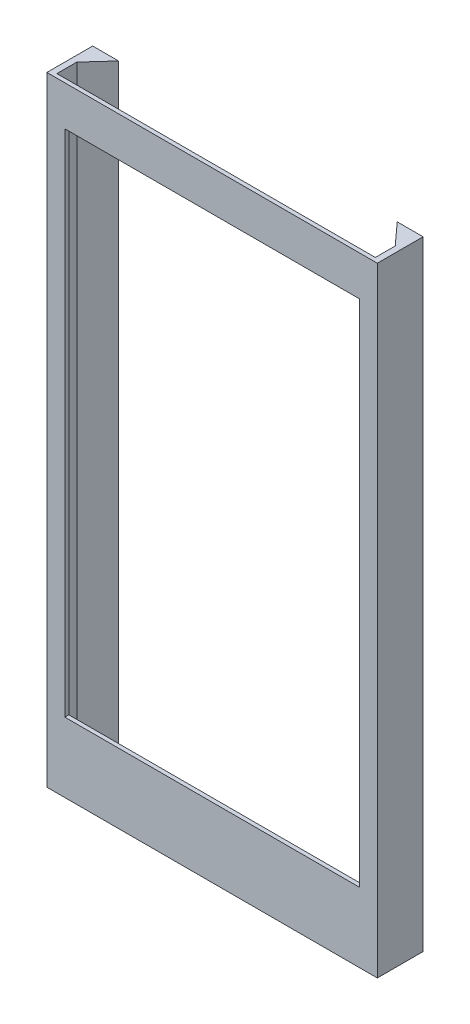
ISO-10303-21;
HEADER;
FILE_DESCRIPTION(('STEP AP214'),'2;1');
FILE_NAME('part.step','',(''),(''),'','','');
FILE_SCHEMA(('AUTOMOTIVE_DESIGN { 1 0 10303 214 1 1 1 1 }'));
ENDSEC;
DATA;
#1=APPLICATION_CONTEXT('core data for automotive mechanical design processes');
#2=APPLICATION_PROTOCOL_DEFINITION('international standard','automotive_design',2000,#1);
#3=PRODUCT_CONTEXT('',#1,'mechanical');
#4=PRODUCT('Part','Part','',(#3));
#5=PRODUCT_RELATED_PRODUCT_CATEGORY('part','',(#4));
#6=PRODUCT_DEFINITION_FORMATION('','',#4);
#7=PRODUCT_DEFINITION_CONTEXT('part definition',#1,'design');
#8=PRODUCT_DEFINITION('design','',#6,#7);
#9=PRODUCT_DEFINITION_SHAPE('','',#8);
#10=(LENGTH_UNIT() NAMED_UNIT(*) SI_UNIT(.MILLI.,.METRE.));
#11=(NAMED_UNIT(*) PLANE_ANGLE_UNIT() SI_UNIT($,.RADIAN.));
#12=(NAMED_UNIT(*) SI_UNIT($,.STERADIAN.) SOLID_ANGLE_UNIT());
#13=UNCERTAINTY_MEASURE_WITH_UNIT(LENGTH_MEASURE(1.E-05),#10,'distance_accuracy_value','');
#14=(GEOMETRIC_REPRESENTATION_CONTEXT(3) GLOBAL_UNCERTAINTY_ASSIGNED_CONTEXT((#13)) GLOBAL_UNIT_ASSIGNED_CONTEXT((#10,
#11,#12)) REPRESENTATION_CONTEXT('',''));
#15=CARTESIAN_POINT('',(0.,0.,0.));
#16=DIRECTION('',(0.,0.,1.));
#17=DIRECTION('',(1.,0.,0.));
#18=AXIS2_PLACEMENT_3D('',#15,#16,#17);
#19=CARTESIAN_POINT('',(40.,-77.,10.5));
#20=DIRECTION('',(0.,-1.,0.));
#21=DIRECTION('',(0.,0.,-1.));
#22=AXIS2_PLACEMENT_3D('',#19,#20,#21);
#23=PLANE('',#22);
#24=DIRECTION('',(0.672672793996312,0.,0.739940073395944));
#25=VECTOR('',#24,1.);
#26=CARTESIAN_POINT('',(40.,-77.,5.5));
#27=LINE('',#26,#25);
#28=CARTESIAN_POINT('',(35.,-77.,0.));
#29=VERTEX_POINT('',#28);
#30=CARTESIAN_POINT('',(40.,-77.,5.5));
#31=VERTEX_POINT('',#30);
#32=EDGE_CURVE('E55',#29,#31,#27,.T.);
#33=ORIENTED_EDGE('',*,*,#32,.F.);
#34=DIRECTION('',(-1.,0.,0.));
#35=VECTOR('',#34,1.);
#36=CARTESIAN_POINT('',(40.,-77.,0.));
#37=LINE('',#36,#35);
#38=CARTESIAN_POINT('',(-35.,-77.,0.));
#39=VERTEX_POINT('',#38);
#40=EDGE_CURVE('E165',#29,#39,#37,.T.);
#41=ORIENTED_EDGE('',*,*,#40,.T.);
#42=DIRECTION('',(0.672672793996312,0.,-0.739940073395944));
#43=VECTOR('',#42,1.);
#44=CARTESIAN_POINT('',(-40.,-77.,5.5));
#45=LINE('',#44,#43);
#46=CARTESIAN_POINT('',(-40.,-77.,5.5));
#47=VERTEX_POINT('',#46);
#48=EDGE_CURVE('E167',#47,#39,#45,.T.);
#49=ORIENTED_EDGE('',*,*,#48,.F.);
#50=DIRECTION('',(0.,0.,-1.));
#51=VECTOR('',#50,1.);
#52=CARTESIAN_POINT('',(-40.,-77.,10.5));
#53=LINE('',#52,#51);
#54=CARTESIAN_POINT('',(-40.,-77.,10.5));
#55=VERTEX_POINT('',#54);
#56=EDGE_CURVE('E212',#55,#47,#53,.T.);
#57=ORIENTED_EDGE('',*,*,#56,.F.);
#58=DIRECTION('',(-1.,0.,0.));
#59=VECTOR('',#58,1.);
#60=CARTESIAN_POINT('',(40.,-77.,10.5));
#61=LINE('',#60,#59);
#62=CARTESIAN_POINT('',(40.,-77.,10.5));
#63=VERTEX_POINT('',#62);
#64=EDGE_CURVE('E191',#63,#55,#61,.T.);
#65=ORIENTED_EDGE('',*,*,#64,.F.);
#66=DIRECTION('',(0.,0.,-1.));
#67=VECTOR('',#66,1.);
#68=CARTESIAN_POINT('',(40.,-77.,10.5));
#69=LINE('',#68,#67);
#70=EDGE_CURVE('E202',#63,#31,#69,.T.);
#71=ORIENTED_EDGE('',*,*,#70,.T.);
#72=EDGE_LOOP('',(#33,#41,#49,#57,#65,#71));
#73=FACE_BOUND('',#72,.T.);
#74=ADVANCED_FACE('F39',(#73),#23,.F.);
#75=CARTESIAN_POINT('',(40.,77.,10.5));
#76=DIRECTION('',(1.,0.,0.));
#77=DIRECTION('',(0.,0.,-1.));
#78=AXIS2_PLACEMENT_3D('',#75,#76,#77);
#79=PLANE('',#78);
#80=DIRECTION('',(0.,-1.,0.));
#81=VECTOR('',#80,1.);
#82=CARTESIAN_POINT('',(40.,77.,5.5));
#83=LINE('',#82,#81);
#84=CARTESIAN_POINT('',(40.,77.,5.5));
#85=VERTEX_POINT('',#84);
#86=EDGE_CURVE('E160',#85,#31,#83,.T.);
#87=ORIENTED_EDGE('',*,*,#86,.T.);
#88=ORIENTED_EDGE('',*,*,#70,.F.);
#89=DIRECTION('',(0.,-1.,0.));
#90=VECTOR('',#89,1.);
#91=CARTESIAN_POINT('',(40.,77.,10.5));
#92=LINE('',#91,#90);
#93=CARTESIAN_POINT('',(40.,77.,10.5));
#94=VERTEX_POINT('',#93);
#95=EDGE_CURVE('E187',#94,#63,#92,.T.);
#96=ORIENTED_EDGE('',*,*,#95,.F.);
#97=DIRECTION('',(0.,0.,-1.));
#98=VECTOR('',#97,1.);
#99=CARTESIAN_POINT('',(40.,77.,10.5));
#100=LINE('',#99,#98);
#101=EDGE_CURVE('E63',#94,#85,#100,.T.);
#102=ORIENTED_EDGE('',*,*,#101,.T.);
#103=EDGE_LOOP('',(#87,#88,#96,#102));
#104=FACE_BOUND('',#103,.T.);
#105=ADVANCED_FACE('F334',(#104),#79,.F.);
#106=CARTESIAN_POINT('',(-40.,77.,10.5));
#107=DIRECTION('',(-1.,0.,0.));
#108=DIRECTION('',(0.,0.,1.));
#109=AXIS2_PLACEMENT_3D('',#106,#107,#108);
#110=PLANE('',#109);
#111=DIRECTION('',(0.,-1.,0.));
#112=VECTOR('',#111,1.);
#113=CARTESIAN_POINT('',(-40.,77.,5.5));
#114=LINE('',#113,#112);
#115=CARTESIAN_POINT('',(-40.,77.,5.5));
#116=VERTEX_POINT('',#115);
#117=EDGE_CURVE('E183',#116,#47,#114,.T.);
#118=ORIENTED_EDGE('',*,*,#117,.F.);
#119=DIRECTION('',(0.,0.,-1.));
#120=VECTOR('',#119,1.);
#121=CARTESIAN_POINT('',(-40.,77.,10.5));
#122=LINE('',#121,#120);
#123=CARTESIAN_POINT('',(-40.,77.,10.5));
#124=VERTEX_POINT('',#123);
#125=EDGE_CURVE('E208',#124,#116,#122,.T.);
#126=ORIENTED_EDGE('',*,*,#125,.F.);
#127=DIRECTION('',(0.,1.,0.));
#128=VECTOR('',#127,1.);
#129=CARTESIAN_POINT('',(-40.,77.,10.5));
#130=LINE('',#129,#128);
#131=EDGE_CURVE('E195',#55,#124,#130,.T.);
#132=ORIENTED_EDGE('',*,*,#131,.F.);
#133=ORIENTED_EDGE('',*,*,#56,.T.);
#134=EDGE_LOOP('',(#118,#126,#132,#133));
#135=FACE_BOUND('',#134,.T.);
#136=ADVANCED_FACE('F327',(#135),#110,.F.);
#137=CARTESIAN_POINT('',(-37.,67.,11.5));
#138=DIRECTION('',(1.,0.,0.));
#139=DIRECTION('',(0.,1.,0.));
#140=AXIS2_PLACEMENT_3D('',#137,#138,#139);
#141=PLANE('',#140);
#142=DIRECTION('',(0.,0.,-1.));
#143=VECTOR('',#142,1.);
#144=CARTESIAN_POINT('',(-37.,-61.,11.5));
#145=LINE('',#144,#143);
#146=CARTESIAN_POINT('',(-37.,-61.,11.5));
#147=VERTEX_POINT('',#146);
#148=CARTESIAN_POINT('',(-37.,-61.,10.5));
#149=VERTEX_POINT('',#148);
#150=EDGE_CURVE('E254',#147,#149,#145,.T.);
#151=ORIENTED_EDGE('',*,*,#150,.T.);
#152=DIRECTION('',(0.,1.,0.));
#153=VECTOR('',#152,1.);
#154=CARTESIAN_POINT('',(-37.,67.,10.5));
#155=LINE('',#154,#153);
#156=CARTESIAN_POINT('',(-37.,67.,10.5));
#157=VERTEX_POINT('',#156);
#158=EDGE_CURVE('E225',#149,#157,#155,.T.);
#159=ORIENTED_EDGE('',*,*,#158,.T.);
#160=DIRECTION('',(0.,0.,-1.));
#161=VECTOR('',#160,1.);
#162=CARTESIAN_POINT('',(-37.,67.,11.5));
#163=LINE('',#162,#161);
#164=CARTESIAN_POINT('',(-37.,67.,11.5));
#165=VERTEX_POINT('',#164);
#166=EDGE_CURVE('E242',#165,#157,#163,.T.);
#167=ORIENTED_EDGE('',*,*,#166,.F.);
#168=DIRECTION('',(0.,-1.,0.));
#169=VECTOR('',#168,1.);
#170=CARTESIAN_POINT('',(-37.,67.,11.5));
#171=LINE('',#170,#169);
#172=EDGE_CURVE('E229',#165,#147,#171,.T.);
#173=ORIENTED_EDGE('',*,*,#172,.T.);
#174=EDGE_LOOP('',(#151,#159,#167,#173));
#175=FACE_BOUND('',#174,.T.);
#176=ADVANCED_FACE('F325',(#175),#141,.T.);
#177=CARTESIAN_POINT('',(-37.,-61.,11.5));
#178=DIRECTION('',(0.,1.,0.));
#179=DIRECTION('',(0.,0.,1.));
#180=AXIS2_PLACEMENT_3D('',#177,#178,#179);
#181=PLANE('',#180);
#182=DIRECTION('',(0.,0.,-1.));
#183=VECTOR('',#182,1.);
#184=CARTESIAN_POINT('',(37.,-61.,11.5));
#185=LINE('',#184,#183);
#186=CARTESIAN_POINT('',(37.,-61.,11.5));
#187=VERTEX_POINT('',#186);
#188=CARTESIAN_POINT('',(37.,-61.,10.5));
#189=VERTEX_POINT('',#188);
#190=EDGE_CURVE('E250',#187,#189,#185,.T.);
#191=ORIENTED_EDGE('',*,*,#190,.T.);
#192=DIRECTION('',(-1.,0.,0.));
#193=VECTOR('',#192,1.);
#194=CARTESIAN_POINT('',(-37.,-61.,10.5));
#195=LINE('',#194,#193);
#196=EDGE_CURVE('E221',#189,#149,#195,.T.);
#197=ORIENTED_EDGE('',*,*,#196,.T.);
#198=ORIENTED_EDGE('',*,*,#150,.F.);
#199=DIRECTION('',(1.,0.,0.));
#200=VECTOR('',#199,1.);
#201=CARTESIAN_POINT('',(-37.,-61.,11.5));
#202=LINE('',#201,#200);
#203=EDGE_CURVE('E232',#147,#187,#202,.T.);
#204=ORIENTED_EDGE('',*,*,#203,.T.);
#205=EDGE_LOOP('',(#191,#197,#198,#204));
#206=FACE_BOUND('',#205,.T.);
#207=ADVANCED_FACE('F316',(#206),#181,.T.);
#208=CARTESIAN_POINT('',(37.,67.,11.5));
#209=DIRECTION('',(-1.,0.,0.));
#210=DIRECTION('',(0.,-1.,0.));
#211=AXIS2_PLACEMENT_3D('',#208,#209,#210);
#212=PLANE('',#211);
#213=DIRECTION('',(0.,0.,-1.));
#214=VECTOR('',#213,1.);
#215=CARTESIAN_POINT('',(37.,67.,11.5));
#216=LINE('',#215,#214);
#217=CARTESIAN_POINT('',(37.,67.,11.5));
#218=VERTEX_POINT('',#217);
#219=CARTESIAN_POINT('',(37.,67.,10.5));
#220=VERTEX_POINT('',#219);
#221=EDGE_CURVE('E246',#218,#220,#216,.T.);
#222=ORIENTED_EDGE('',*,*,#221,.T.);
#223=DIRECTION('',(0.,-1.,0.));
#224=VECTOR('',#223,1.);
#225=CARTESIAN_POINT('',(37.,67.,10.5));
#226=LINE('',#225,#224);
#227=EDGE_CURVE('E207',#220,#189,#226,.T.);
#228=ORIENTED_EDGE('',*,*,#227,.T.);
#229=ORIENTED_EDGE('',*,*,#190,.F.);
#230=DIRECTION('',(0.,1.,0.));
#231=VECTOR('',#230,1.);
#232=CARTESIAN_POINT('',(37.,67.,11.5));
#233=LINE('',#232,#231);
#234=EDGE_CURVE('E235',#187,#218,#233,.T.);
#235=ORIENTED_EDGE('',*,*,#234,.T.);
#236=EDGE_LOOP('',(#222,#228,#229,#235));
#237=FACE_BOUND('',#236,.T.);
#238=ADVANCED_FACE('F318',(#237),#212,.T.);
#239=CARTESIAN_POINT('',(-37.,67.,11.5));
#240=DIRECTION('',(0.,-1.,0.));
#241=DIRECTION('',(0.,0.,-1.));
#242=AXIS2_PLACEMENT_3D('',#239,#240,#241);
#243=PLANE('',#242);
#244=ORIENTED_EDGE('',*,*,#166,.T.);
#245=DIRECTION('',(1.,0.,0.));
#246=VECTOR('',#245,1.);
#247=CARTESIAN_POINT('',(-37.,67.,10.5));
#248=LINE('',#247,#246);
#249=EDGE_CURVE('E11',#157,#220,#248,.T.);
#250=ORIENTED_EDGE('',*,*,#249,.T.);
#251=ORIENTED_EDGE('',*,*,#221,.F.);
#252=DIRECTION('',(-1.,0.,0.));
#253=VECTOR('',#252,1.);
#254=CARTESIAN_POINT('',(-37.,67.,11.5));
#255=LINE('',#254,#253);
#256=EDGE_CURVE('E239',#218,#165,#255,.T.);
#257=ORIENTED_EDGE('',*,*,#256,.T.);
#258=EDGE_LOOP('',(#244,#250,#251,#257));
#259=FACE_BOUND('',#258,.T.);
#260=ADVANCED_FACE('F307',(#259),#243,.T.);
#261=CARTESIAN_POINT('',(0.,0.,11.5));
#262=DIRECTION('',(0.,0.,1.));
#263=DIRECTION('',(1.,0.,0.));
#264=AXIS2_PLACEMENT_3D('',#261,#262,#263);
#265=PLANE('',#264);
#266=DIRECTION('',(-1.,0.,0.));
#267=VECTOR('',#266,1.);
#268=CARTESIAN_POINT('',(41.5,77.,11.5));
#269=LINE('',#268,#267);
#270=CARTESIAN_POINT('',(41.5,77.,11.5));
#271=VERTEX_POINT('',#270);
#272=CARTESIAN_POINT('',(-41.5,77.,11.5));
#273=VERTEX_POINT('',#272);
#274=EDGE_CURVE('E258',#271,#273,#269,.T.);
#275=ORIENTED_EDGE('',*,*,#274,.T.);
#276=DIRECTION('',(0.,-1.,0.));
#277=VECTOR('',#276,1.);
#278=CARTESIAN_POINT('',(-41.5,77.,11.5));
#279=LINE('',#278,#277);
#280=CARTESIAN_POINT('',(-41.5,-78.5,11.5));
#281=VERTEX_POINT('',#280);
#282=EDGE_CURVE('E261',#273,#281,#279,.T.);
#283=ORIENTED_EDGE('',*,*,#282,.T.);
#284=DIRECTION('',(1.,0.,0.));
#285=VECTOR('',#284,1.);
#286=CARTESIAN_POINT('',(-41.5,-78.5,11.5));
#287=LINE('',#286,#285);
#288=CARTESIAN_POINT('',(41.5,-78.5,11.5));
#289=VERTEX_POINT('',#288);
#290=EDGE_CURVE('E265',#281,#289,#287,.T.);
#291=ORIENTED_EDGE('',*,*,#290,.T.);
#292=DIRECTION('',(0.,1.,0.));
#293=VECTOR('',#292,1.);
#294=CARTESIAN_POINT('',(41.5,-78.5,11.5));
#295=LINE('',#294,#293);
#296=EDGE_CURVE('E268',#289,#271,#295,.T.);
#297=ORIENTED_EDGE('',*,*,#296,.T.);
#298=EDGE_LOOP('',(#275,#283,#291,#297));
#299=FACE_BOUND('',#298,.T.);
#300=ORIENTED_EDGE('',*,*,#203,.F.);
#301=ORIENTED_EDGE('',*,*,#172,.F.);
#302=ORIENTED_EDGE('',*,*,#256,.F.);
#303=ORIENTED_EDGE('',*,*,#234,.F.);
#304=EDGE_LOOP('',(#300,#301,#302,#303));
#305=FACE_BOUND('',#304,.T.);
#306=ADVANCED_FACE('F304',(#299,#305),#265,.T.);
#307=CARTESIAN_POINT('',(0.,0.,0.));
#308=DIRECTION('',(0.,0.,1.));
#309=DIRECTION('',(1.,0.,0.));
#310=AXIS2_PLACEMENT_3D('',#307,#308,#309);
#311=PLANE('',#310);
#312=ORIENTED_EDGE('',*,*,#40,.F.);
#313=DIRECTION('',(0.,-1.,0.));
#314=VECTOR('',#313,1.);
#315=CARTESIAN_POINT('',(35.,77.,0.));
#316=LINE('',#315,#314);
#317=CARTESIAN_POINT('',(35.,77.,0.));
#318=VERTEX_POINT('',#317);
#319=EDGE_CURVE('E159',#318,#29,#316,.T.);
#320=ORIENTED_EDGE('',*,*,#319,.F.);
#321=DIRECTION('',(-1.,0.,0.));
#322=VECTOR('',#321,1.);
#323=CARTESIAN_POINT('',(-40.,77.,0.));
#324=LINE('',#323,#322);
#325=CARTESIAN_POINT('',(41.5,77.,0.));
#326=VERTEX_POINT('',#325);
#327=EDGE_CURVE('E141',#326,#318,#324,.T.);
#328=ORIENTED_EDGE('',*,*,#327,.F.);
#329=DIRECTION('',(0.,1.,0.));
#330=VECTOR('',#329,1.);
#331=CARTESIAN_POINT('',(41.5,-78.5,0.));
#332=LINE('',#331,#330);
#333=CARTESIAN_POINT('',(41.5,-78.5,0.));
#334=VERTEX_POINT('',#333);
#335=EDGE_CURVE('E262',#334,#326,#332,.T.);
#336=ORIENTED_EDGE('',*,*,#335,.F.);
#337=DIRECTION('',(1.,0.,0.));
#338=VECTOR('',#337,1.);
#339=CARTESIAN_POINT('',(-41.5,-78.5,0.));
#340=LINE('',#339,#338);
#341=CARTESIAN_POINT('',(-41.5,-78.5,0.));
#342=VERTEX_POINT('',#341);
#343=EDGE_CURVE('E273',#342,#334,#340,.T.);
#344=ORIENTED_EDGE('',*,*,#343,.F.);
#345=DIRECTION('',(0.,-1.,0.));
#346=VECTOR('',#345,1.);
#347=CARTESIAN_POINT('',(-41.5,77.,0.));
#348=LINE('',#347,#346);
#349=CARTESIAN_POINT('',(-41.5,77.,0.));
#350=VERTEX_POINT('',#349);
#351=EDGE_CURVE('E153',#350,#342,#348,.T.);
#352=ORIENTED_EDGE('',*,*,#351,.F.);
#353=CARTESIAN_POINT('',(-35.,77.,0.));
#354=VERTEX_POINT('',#353);
#355=EDGE_CURVE('E154',#354,#350,#324,.T.);
#356=ORIENTED_EDGE('',*,*,#355,.F.);
#357=DIRECTION('',(0.,-1.,0.));
#358=VECTOR('',#357,1.);
#359=CARTESIAN_POINT('',(-35.,77.,0.));
#360=LINE('',#359,#358);
#361=EDGE_CURVE('E179',#354,#39,#360,.T.);
#362=ORIENTED_EDGE('',*,*,#361,.T.);
#363=EDGE_LOOP('',(#312,#320,#328,#336,#344,#352,#356,#362));
#364=FACE_BOUND('',#363,.T.);
#365=ADVANCED_FACE('F163',(#364),#311,.F.);
#366=CARTESIAN_POINT('',(-40.,77.,11.5));
#367=DIRECTION('',(0.,-1.,0.));
#368=DIRECTION('',(1.,0.,0.));
#369=AXIS2_PLACEMENT_3D('',#366,#367,#368);
#370=PLANE('',#369);
#371=ORIENTED_EDGE('',*,*,#327,.T.);
#372=DIRECTION('',(0.672672793996312,0.,0.739940073395944));
#373=VECTOR('',#372,1.);
#374=CARTESIAN_POINT('',(40.,77.,5.5));
#375=LINE('',#374,#373);
#376=EDGE_CURVE('E143',#318,#85,#375,.T.);
#377=ORIENTED_EDGE('',*,*,#376,.T.);
#378=ORIENTED_EDGE('',*,*,#101,.F.);
#379=DIRECTION('',(1.,0.,0.));
#380=VECTOR('',#379,1.);
#381=CARTESIAN_POINT('',(40.,77.,10.5));
#382=LINE('',#381,#380);
#383=EDGE_CURVE('E198',#124,#94,#382,.T.);
#384=ORIENTED_EDGE('',*,*,#383,.F.);
#385=ORIENTED_EDGE('',*,*,#125,.T.);
#386=DIRECTION('',(0.672672793996312,0.,-0.739940073395944));
#387=VECTOR('',#386,1.);
#388=CARTESIAN_POINT('',(-40.,77.,5.5));
#389=LINE('',#388,#387);
#390=EDGE_CURVE('E172',#116,#354,#389,.T.);
#391=ORIENTED_EDGE('',*,*,#390,.T.);
#392=ORIENTED_EDGE('',*,*,#355,.T.);
#393=DIRECTION('',(0.,0.,-1.));
#394=VECTOR('',#393,1.);
#395=CARTESIAN_POINT('',(-41.5,77.,11.5));
#396=LINE('',#395,#394);
#397=EDGE_CURVE('E48',#273,#350,#396,.T.);
#398=ORIENTED_EDGE('',*,*,#397,.F.);
#399=ORIENTED_EDGE('',*,*,#274,.F.);
#400=DIRECTION('',(0.,0.,-1.));
#401=VECTOR('',#400,1.);
#402=CARTESIAN_POINT('',(41.5,77.,11.5));
#403=LINE('',#402,#401);
#404=EDGE_CURVE('E147',#271,#326,#403,.T.);
#405=ORIENTED_EDGE('',*,*,#404,.T.);
#406=EDGE_LOOP('',(#371,#377,#378,#384,#385,#391,#392,#398,#399,#405));
#407=FACE_BOUND('',#406,.T.);
#408=ADVANCED_FACE('F41',(#407),#370,.F.);
#409=CARTESIAN_POINT('',(-41.5,77.,11.5));
#410=DIRECTION('',(1.,0.,0.));
#411=DIRECTION('',(0.,1.,0.));
#412=AXIS2_PLACEMENT_3D('',#409,#410,#411);
#413=PLANE('',#412);
#414=ORIENTED_EDGE('',*,*,#351,.T.);
#415=DIRECTION('',(0.,0.,-1.));
#416=VECTOR('',#415,1.);
#417=CARTESIAN_POINT('',(-41.5,-78.5,11.5));
#418=LINE('',#417,#416);
#419=EDGE_CURVE('E284',#281,#342,#418,.T.);
#420=ORIENTED_EDGE('',*,*,#419,.F.);
#421=ORIENTED_EDGE('',*,*,#282,.F.);
#422=ORIENTED_EDGE('',*,*,#397,.T.);
#423=EDGE_LOOP('',(#414,#420,#421,#422));
#424=FACE_BOUND('',#423,.T.);
#425=ADVANCED_FACE('F293',(#424),#413,.F.);
#426=CARTESIAN_POINT('',(-41.5,-78.5,11.5));
#427=DIRECTION('',(0.,1.,0.));
#428=DIRECTION('',(0.,0.,1.));
#429=AXIS2_PLACEMENT_3D('',#426,#427,#428);
#430=PLANE('',#429);
#431=ORIENTED_EDGE('',*,*,#343,.T.);
#432=DIRECTION('',(0.,0.,-1.));
#433=VECTOR('',#432,1.);
#434=CARTESIAN_POINT('',(41.5,-78.5,11.5));
#435=LINE('',#434,#433);
#436=EDGE_CURVE('E280',#289,#334,#435,.T.);
#437=ORIENTED_EDGE('',*,*,#436,.F.);
#438=ORIENTED_EDGE('',*,*,#290,.F.);
#439=ORIENTED_EDGE('',*,*,#419,.T.);
#440=EDGE_LOOP('',(#431,#437,#438,#439));
#441=FACE_BOUND('',#440,.T.);
#442=ADVANCED_FACE('F298',(#441),#430,.F.);
#443=CARTESIAN_POINT('',(41.5,-78.5,11.5));
#444=DIRECTION('',(-1.,0.,0.));
#445=DIRECTION('',(0.,-1.,0.));
#446=AXIS2_PLACEMENT_3D('',#443,#444,#445);
#447=PLANE('',#446);
#448=ORIENTED_EDGE('',*,*,#335,.T.);
#449=ORIENTED_EDGE('',*,*,#404,.F.);
#450=ORIENTED_EDGE('',*,*,#296,.F.);
#451=ORIENTED_EDGE('',*,*,#436,.T.);
#452=EDGE_LOOP('',(#448,#449,#450,#451));
#453=FACE_BOUND('',#452,.T.);
#454=ADVANCED_FACE('F302',(#453),#447,.F.);
#455=CARTESIAN_POINT('',(0.,0.,10.5));
#456=DIRECTION('',(0.,0.,-1.));
#457=DIRECTION('',(-1.,0.,0.));
#458=AXIS2_PLACEMENT_3D('',#455,#456,#457);
#459=PLANE('',#458);
#460=ORIENTED_EDGE('',*,*,#196,.F.);
#461=ORIENTED_EDGE('',*,*,#227,.F.);
#462=ORIENTED_EDGE('',*,*,#249,.F.);
#463=ORIENTED_EDGE('',*,*,#158,.F.);
#464=EDGE_LOOP('',(#460,#461,#462,#463));
#465=FACE_BOUND('',#464,.T.);
#466=ORIENTED_EDGE('',*,*,#95,.T.);
#467=ORIENTED_EDGE('',*,*,#64,.T.);
#468=ORIENTED_EDGE('',*,*,#131,.T.);
#469=ORIENTED_EDGE('',*,*,#383,.T.);
#470=EDGE_LOOP('',(#466,#467,#468,#469));
#471=FACE_BOUND('',#470,.T.);
#472=ADVANCED_FACE('F320',(#465,#471),#459,.T.);
#473=CARTESIAN_POINT('',(-40.,77.,5.5));
#474=DIRECTION('',(-0.739940073395944,0.,-0.672672793996312));
#475=DIRECTION('',(-0.672672793996312,0.,0.739940073395944));
#476=AXIS2_PLACEMENT_3D('',#473,#474,#475);
#477=PLANE('',#476);
#478=ORIENTED_EDGE('',*,*,#48,.T.);
#479=ORIENTED_EDGE('',*,*,#361,.F.);
#480=ORIENTED_EDGE('',*,*,#390,.F.);
#481=ORIENTED_EDGE('',*,*,#117,.T.);
#482=EDGE_LOOP('',(#478,#479,#480,#481));
#483=FACE_BOUND('',#482,.T.);
#484=ADVANCED_FACE('F396',(#483),#477,.F.);
#485=CARTESIAN_POINT('',(40.,77.,5.5));
#486=DIRECTION('',(0.739940073395944,0.,-0.672672793996312));
#487=DIRECTION('',(-0.672672793996312,0.,-0.739940073395944));
#488=AXIS2_PLACEMENT_3D('',#485,#486,#487);
#489=PLANE('',#488);
#490=ORIENTED_EDGE('',*,*,#32,.T.);
#491=ORIENTED_EDGE('',*,*,#86,.F.);
#492=ORIENTED_EDGE('',*,*,#376,.F.);
#493=ORIENTED_EDGE('',*,*,#319,.T.);
#494=EDGE_LOOP('',(#490,#491,#492,#493));
#495=FACE_BOUND('',#494,.T.);
#496=ADVANCED_FACE('F158',(#495),#489,.F.);
#497=CLOSED_SHELL('',(#74,#105,#136,#176,#207,#238,#260,#306,#365,#408,#425,#442,#454,#472,#484,#496));
#498=MANIFOLD_SOLID_BREP('B2',#497);
#499=ADVANCED_BREP_SHAPE_REPRESENTATION('',(#18,#498),#14);
#500=SHAPE_DEFINITION_REPRESENTATION(#9,#499);
ENDSEC;
END-ISO-10303-21;
